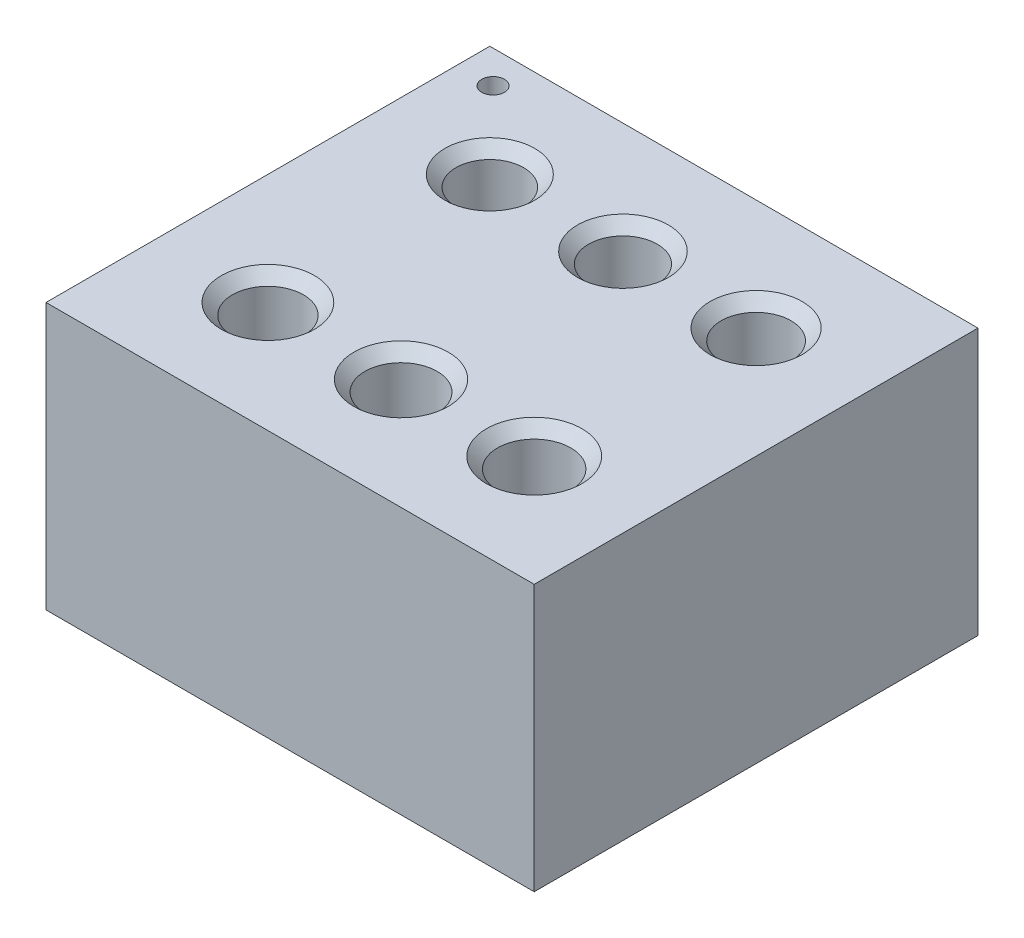
ISO-10303-21;
HEADER;
FILE_DESCRIPTION(('STEP AP214'),'2;1');
FILE_NAME('part.step','',(''),(''),'','','');
FILE_SCHEMA(('AUTOMOTIVE_DESIGN { 1 0 10303 214 1 1 1 1 }'));
ENDSEC;
DATA;
#1=APPLICATION_CONTEXT('core data for automotive mechanical design processes');
#2=APPLICATION_PROTOCOL_DEFINITION('international standard','automotive_design',2000,#1);
#3=PRODUCT_CONTEXT('',#1,'mechanical');
#4=PRODUCT('Part','Part','',(#3));
#5=PRODUCT_RELATED_PRODUCT_CATEGORY('part','',(#4));
#6=PRODUCT_DEFINITION_FORMATION('','',#4);
#7=PRODUCT_DEFINITION_CONTEXT('part definition',#1,'design');
#8=PRODUCT_DEFINITION('design','',#6,#7);
#9=PRODUCT_DEFINITION_SHAPE('','',#8);
#10=(LENGTH_UNIT() NAMED_UNIT(*) SI_UNIT(.MILLI.,.METRE.));
#11=(NAMED_UNIT(*) PLANE_ANGLE_UNIT() SI_UNIT($,.RADIAN.));
#12=(NAMED_UNIT(*) SI_UNIT($,.STERADIAN.) SOLID_ANGLE_UNIT());
#13=UNCERTAINTY_MEASURE_WITH_UNIT(LENGTH_MEASURE(1.E-05),#10,'distance_accuracy_value','');
#14=(GEOMETRIC_REPRESENTATION_CONTEXT(3) GLOBAL_UNCERTAINTY_ASSIGNED_CONTEXT((#13)) GLOBAL_UNIT_ASSIGNED_CONTEXT((#10,
#11,#12)) REPRESENTATION_CONTEXT('',''));
#15=CARTESIAN_POINT('',(0.,0.,0.));
#16=DIRECTION('',(0.,0.,1.));
#17=DIRECTION('',(1.,0.,0.));
#18=AXIS2_PLACEMENT_3D('',#15,#16,#17);
#19=CARTESIAN_POINT('',(0.,-12.,10.));
#20=DIRECTION('',(0.,0.,1.));
#21=DIRECTION('',(1.,0.,0.));
#22=AXIS2_PLACEMENT_3D('',#19,#20,#21);
#23=PLANE('',#22);
#24=DIRECTION('',(1.,0.,0.));
#25=VECTOR('',#24,1.);
#26=CARTESIAN_POINT('',(0.,0.,10.));
#27=LINE('',#26,#25);
#28=CARTESIAN_POINT('',(-11.,0.,10.));
#29=VERTEX_POINT('',#28);
#30=CARTESIAN_POINT('',(11.,0.,10.));
#31=VERTEX_POINT('',#30);
#32=EDGE_CURVE('E130',#29,#31,#27,.T.);
#33=ORIENTED_EDGE('',*,*,#32,.F.);
#34=DIRECTION('',(0.,1.,0.));
#35=VECTOR('',#34,1.);
#36=CARTESIAN_POINT('',(-11.,-12.,10.));
#37=LINE('',#36,#35);
#38=CARTESIAN_POINT('',(-11.,-12.,10.));
#39=VERTEX_POINT('',#38);
#40=EDGE_CURVE('E67',#39,#29,#37,.T.);
#41=ORIENTED_EDGE('',*,*,#40,.F.);
#42=DIRECTION('',(1.,0.,0.));
#43=VECTOR('',#42,1.);
#44=CARTESIAN_POINT('',(0.,-12.,10.));
#45=LINE('',#44,#43);
#46=CARTESIAN_POINT('',(11.,-12.,10.));
#47=VERTEX_POINT('',#46);
#48=EDGE_CURVE('E117',#39,#47,#45,.T.);
#49=ORIENTED_EDGE('',*,*,#48,.T.);
#50=DIRECTION('',(0.,1.,0.));
#51=VECTOR('',#50,1.);
#52=CARTESIAN_POINT('',(11.,-12.,10.));
#53=LINE('',#52,#51);
#54=EDGE_CURVE('E95',#47,#31,#53,.T.);
#55=ORIENTED_EDGE('',*,*,#54,.T.);
#56=EDGE_LOOP('',(#33,#41,#49,#55));
#57=FACE_BOUND('',#56,.T.);
#58=ADVANCED_FACE('F48',(#57),#23,.T.);
#59=CARTESIAN_POINT('',(-11.,-12.,0.));
#60=DIRECTION('',(1.,0.,0.));
#61=DIRECTION('',(0.,0.,-1.));
#62=AXIS2_PLACEMENT_3D('',#59,#60,#61);
#63=PLANE('',#62);
#64=DIRECTION('',(0.,0.,-1.));
#65=VECTOR('',#64,1.);
#66=CARTESIAN_POINT('',(-11.,0.,0.));
#67=LINE('',#66,#65);
#68=CARTESIAN_POINT('',(-11.,0.,-10.));
#69=VERTEX_POINT('',#68);
#70=EDGE_CURVE('E140',#29,#69,#67,.T.);
#71=ORIENTED_EDGE('',*,*,#70,.T.);
#72=DIRECTION('',(0.,1.,0.));
#73=VECTOR('',#72,1.);
#74=CARTESIAN_POINT('',(-11.,-12.,-10.));
#75=LINE('',#74,#73);
#76=CARTESIAN_POINT('',(-11.,-12.,-10.));
#77=VERTEX_POINT('',#76);
#78=EDGE_CURVE('E113',#77,#69,#75,.T.);
#79=ORIENTED_EDGE('',*,*,#78,.F.);
#80=DIRECTION('',(0.,0.,-1.));
#81=VECTOR('',#80,1.);
#82=CARTESIAN_POINT('',(-11.,-12.,0.));
#83=LINE('',#82,#81);
#84=EDGE_CURVE('E105',#39,#77,#83,.T.);
#85=ORIENTED_EDGE('',*,*,#84,.F.);
#86=ORIENTED_EDGE('',*,*,#40,.T.);
#87=EDGE_LOOP('',(#71,#79,#85,#86));
#88=FACE_BOUND('',#87,.T.);
#89=ADVANCED_FACE('F210',(#88),#63,.F.);
#90=CARTESIAN_POINT('',(0.,-12.,-10.));
#91=DIRECTION('',(0.,0.,1.));
#92=DIRECTION('',(1.,0.,0.));
#93=AXIS2_PLACEMENT_3D('',#90,#91,#92);
#94=PLANE('',#93);
#95=DIRECTION('',(1.,0.,0.));
#96=VECTOR('',#95,1.);
#97=CARTESIAN_POINT('',(0.,0.,-10.));
#98=LINE('',#97,#96);
#99=CARTESIAN_POINT('',(11.,0.,-10.));
#100=VERTEX_POINT('',#99);
#101=EDGE_CURVE('E85',#69,#100,#98,.T.);
#102=ORIENTED_EDGE('',*,*,#101,.T.);
#103=DIRECTION('',(0.,1.,0.));
#104=VECTOR('',#103,1.);
#105=CARTESIAN_POINT('',(11.,-12.,-10.));
#106=LINE('',#105,#104);
#107=CARTESIAN_POINT('',(11.,-12.,-10.));
#108=VERTEX_POINT('',#107);
#109=EDGE_CURVE('E110',#108,#100,#106,.T.);
#110=ORIENTED_EDGE('',*,*,#109,.F.);
#111=DIRECTION('',(1.,0.,0.));
#112=VECTOR('',#111,1.);
#113=CARTESIAN_POINT('',(0.,-12.,-10.));
#114=LINE('',#113,#112);
#115=EDGE_CURVE('E100',#77,#108,#114,.T.);
#116=ORIENTED_EDGE('',*,*,#115,.F.);
#117=ORIENTED_EDGE('',*,*,#78,.T.);
#118=EDGE_LOOP('',(#102,#110,#116,#117));
#119=FACE_BOUND('',#118,.T.);
#120=ADVANCED_FACE('F111',(#119),#94,.F.);
#121=CARTESIAN_POINT('',(-9.38156460825946,-12.,-8.52869509841769));
#122=DIRECTION('',(0.,1.,0.));
#123=DIRECTION('',(0.,0.,1.));
#124=AXIS2_PLACEMENT_3D('',#121,#122,#123);
#125=CYLINDRICAL_SURFACE('',#124,0.511248756854966);
#126=CARTESIAN_POINT('',(-9.38156460825946,-12.,-8.52869509841769));
#127=DIRECTION('',(0.,1.,0.));
#128=DIRECTION('',(0.,0.,1.));
#129=AXIS2_PLACEMENT_3D('',#126,#127,#128);
#130=CIRCLE('',#129,0.511248756854966);
#131=CARTESIAN_POINT('',(-9.38156460825946,-12.,-8.01744634156273));
#132=VERTEX_POINT('',#131);
#133=EDGE_CURVE('E120',#132,#132,#130,.T.);
#134=ORIENTED_EDGE('',*,*,#133,.F.);
#135=EDGE_LOOP('',(#134));
#136=FACE_BOUND('',#135,.T.);
#137=CARTESIAN_POINT('',(-9.38156460825946,0.,-8.52869509841769));
#138=DIRECTION('',(0.,1.,0.));
#139=DIRECTION('',(0.,0.,1.));
#140=AXIS2_PLACEMENT_3D('',#137,#138,#139);
#141=CIRCLE('',#140,0.511248756854966);
#142=CARTESIAN_POINT('',(-9.38156460825946,0.,-8.01744634156273));
#143=VERTEX_POINT('',#142);
#144=EDGE_CURVE('E126',#143,#143,#141,.T.);
#145=ORIENTED_EDGE('',*,*,#144,.T.);
#146=EDGE_LOOP('',(#145));
#147=FACE_BOUND('',#146,.T.);
#148=ADVANCED_FACE('F219',(#136,#147),#125,.F.);
#149=CARTESIAN_POINT('',(11.,-12.,0.));
#150=DIRECTION('',(1.,0.,0.));
#151=DIRECTION('',(0.,0.,-1.));
#152=AXIS2_PLACEMENT_3D('',#149,#150,#151);
#153=PLANE('',#152);
#154=DIRECTION('',(0.,0.,-1.));
#155=VECTOR('',#154,1.);
#156=CARTESIAN_POINT('',(11.,0.,0.));
#157=LINE('',#156,#155);
#158=EDGE_CURVE('E135',#31,#100,#157,.T.);
#159=ORIENTED_EDGE('',*,*,#158,.F.);
#160=ORIENTED_EDGE('',*,*,#54,.F.);
#161=DIRECTION('',(0.,0.,-1.));
#162=VECTOR('',#161,1.);
#163=CARTESIAN_POINT('',(11.,-12.,0.));
#164=LINE('',#163,#162);
#165=EDGE_CURVE('E104',#47,#108,#164,.T.);
#166=ORIENTED_EDGE('',*,*,#165,.T.);
#167=ORIENTED_EDGE('',*,*,#109,.T.);
#168=EDGE_LOOP('',(#159,#160,#166,#167));
#169=FACE_BOUND('',#168,.T.);
#170=ADVANCED_FACE('F115',(#169),#153,.T.);
#171=CARTESIAN_POINT('',(0.,-12.,0.));
#172=DIRECTION('',(0.,1.,0.));
#173=DIRECTION('',(0.,0.,1.));
#174=AXIS2_PLACEMENT_3D('',#171,#172,#173);
#175=PLANE('',#174);
#176=CARTESIAN_POINT('',(6.,-12.,5.));
#177=DIRECTION('',(0.,1.,0.));
#178=DIRECTION('',(0.,0.,1.));
#179=AXIS2_PLACEMENT_3D('',#176,#177,#178);
#180=CIRCLE('',#179,1.65);
#181=CARTESIAN_POINT('',(6.,-12.,6.65));
#182=VERTEX_POINT('',#181);
#183=EDGE_CURVE('E262',#182,#182,#180,.T.);
#184=ORIENTED_EDGE('',*,*,#183,.T.);
#185=EDGE_LOOP('',(#184));
#186=FACE_BOUND('',#185,.T.);
#187=CARTESIAN_POINT('',(0.,-12.,5.));
#188=DIRECTION('',(0.,1.,0.));
#189=DIRECTION('',(0.,0.,1.));
#190=AXIS2_PLACEMENT_3D('',#187,#188,#189);
#191=CIRCLE('',#190,1.625);
#192=CARTESIAN_POINT('',(0.,-12.,6.625));
#193=VERTEX_POINT('',#192);
#194=EDGE_CURVE('E265',#193,#193,#191,.T.);
#195=ORIENTED_EDGE('',*,*,#194,.T.);
#196=EDGE_LOOP('',(#195));
#197=FACE_BOUND('',#196,.T.);
#198=CARTESIAN_POINT('',(0.,-12.,-5.));
#199=DIRECTION('',(0.,1.,0.));
#200=DIRECTION('',(0.,0.,1.));
#201=AXIS2_PLACEMENT_3D('',#198,#199,#200);
#202=CIRCLE('',#201,1.55);
#203=CARTESIAN_POINT('',(0.,-12.,-3.45));
#204=VERTEX_POINT('',#203);
#205=EDGE_CURVE('E271',#204,#204,#202,.T.);
#206=ORIENTED_EDGE('',*,*,#205,.T.);
#207=EDGE_LOOP('',(#206));
#208=FACE_BOUND('',#207,.T.);
#209=CARTESIAN_POINT('',(-6.,-12.,5.));
#210=DIRECTION('',(0.,1.,0.));
#211=DIRECTION('',(0.,0.,1.));
#212=AXIS2_PLACEMENT_3D('',#209,#210,#211);
#213=CIRCLE('',#212,1.6);
#214=CARTESIAN_POINT('',(-6.,-12.,6.6));
#215=VERTEX_POINT('',#214);
#216=EDGE_CURVE('E276',#215,#215,#213,.T.);
#217=ORIENTED_EDGE('',*,*,#216,.T.);
#218=EDGE_LOOP('',(#217));
#219=FACE_BOUND('',#218,.T.);
#220=CARTESIAN_POINT('',(6.,-12.,-5.));
#221=DIRECTION('',(0.,1.,0.));
#222=DIRECTION('',(0.,0.,1.));
#223=AXIS2_PLACEMENT_3D('',#220,#221,#222);
#224=CIRCLE('',#223,1.575);
#225=CARTESIAN_POINT('',(6.,-12.,-3.425));
#226=VERTEX_POINT('',#225);
#227=EDGE_CURVE('E266',#226,#226,#224,.T.);
#228=ORIENTED_EDGE('',*,*,#227,.T.);
#229=EDGE_LOOP('',(#228));
#230=FACE_BOUND('',#229,.T.);
#231=CARTESIAN_POINT('',(-6.,-12.,-5.));
#232=DIRECTION('',(0.,1.,0.));
#233=DIRECTION('',(0.,0.,1.));
#234=AXIS2_PLACEMENT_3D('',#231,#232,#233);
#235=CIRCLE('',#234,1.525);
#236=CARTESIAN_POINT('',(-6.,-12.,-3.475));
#237=VERTEX_POINT('',#236);
#238=EDGE_CURVE('E131',#237,#237,#235,.T.);
#239=ORIENTED_EDGE('',*,*,#238,.T.);
#240=EDGE_LOOP('',(#239));
#241=FACE_BOUND('',#240,.T.);
#242=ORIENTED_EDGE('',*,*,#133,.T.);
#243=EDGE_LOOP('',(#242));
#244=FACE_BOUND('',#243,.T.);
#245=ORIENTED_EDGE('',*,*,#48,.F.);
#246=ORIENTED_EDGE('',*,*,#84,.T.);
#247=ORIENTED_EDGE('',*,*,#115,.T.);
#248=ORIENTED_EDGE('',*,*,#165,.F.);
#249=EDGE_LOOP('',(#245,#246,#247,#248));
#250=FACE_BOUND('',#249,.T.);
#251=ADVANCED_FACE('F103',(#186,#197,#208,#219,#230,#241,#244,#250),#175,.F.);
#252=CARTESIAN_POINT('',(0.,0.,0.));
#253=DIRECTION('',(0.,1.,0.));
#254=DIRECTION('',(0.,0.,1.));
#255=AXIS2_PLACEMENT_3D('',#252,#253,#254);
#256=PLANE('',#255);
#257=CARTESIAN_POINT('',(-6.,0.,5.));
#258=DIRECTION('',(0.,1.,0.));
#259=DIRECTION('',(0.,0.,1.));
#260=AXIS2_PLACEMENT_3D('',#257,#258,#259);
#261=CIRCLE('',#260,2.10000000000001);
#262=CARTESIAN_POINT('',(-6.,0.,7.10000000000001));
#263=VERTEX_POINT('',#262);
#264=EDGE_CURVE('E173',#263,#263,#261,.F.);
#265=ORIENTED_EDGE('',*,*,#264,.T.);
#266=EDGE_LOOP('',(#265));
#267=FACE_BOUND('',#266,.T.);
#268=CARTESIAN_POINT('',(0.,0.,5.));
#269=DIRECTION('',(0.,1.,0.));
#270=DIRECTION('',(0.,0.,1.));
#271=AXIS2_PLACEMENT_3D('',#268,#269,#270);
#272=CIRCLE('',#271,2.12500000000001);
#273=CARTESIAN_POINT('',(0.,0.,7.12500000000001));
#274=VERTEX_POINT('',#273);
#275=EDGE_CURVE('E169',#274,#274,#272,.F.);
#276=ORIENTED_EDGE('',*,*,#275,.T.);
#277=EDGE_LOOP('',(#276));
#278=FACE_BOUND('',#277,.T.);
#279=CARTESIAN_POINT('',(6.,0.,5.));
#280=DIRECTION('',(0.,1.,0.));
#281=DIRECTION('',(0.,0.,1.));
#282=AXIS2_PLACEMENT_3D('',#279,#280,#281);
#283=CIRCLE('',#282,2.15000000000001);
#284=CARTESIAN_POINT('',(6.,0.,7.15000000000001));
#285=VERTEX_POINT('',#284);
#286=EDGE_CURVE('E165',#285,#285,#283,.F.);
#287=ORIENTED_EDGE('',*,*,#286,.T.);
#288=EDGE_LOOP('',(#287));
#289=FACE_BOUND('',#288,.T.);
#290=CARTESIAN_POINT('',(6.,0.,-5.));
#291=DIRECTION('',(0.,1.,0.));
#292=DIRECTION('',(0.,0.,1.));
#293=AXIS2_PLACEMENT_3D('',#290,#291,#292);
#294=CIRCLE('',#293,2.07500000000001);
#295=CARTESIAN_POINT('',(6.,0.,-2.92499999999999));
#296=VERTEX_POINT('',#295);
#297=EDGE_CURVE('E161',#296,#296,#294,.F.);
#298=ORIENTED_EDGE('',*,*,#297,.T.);
#299=EDGE_LOOP('',(#298));
#300=FACE_BOUND('',#299,.T.);
#301=CARTESIAN_POINT('',(0.,0.,-5.));
#302=DIRECTION('',(0.,1.,0.));
#303=DIRECTION('',(0.,0.,1.));
#304=AXIS2_PLACEMENT_3D('',#301,#302,#303);
#305=CIRCLE('',#304,2.05000000000001);
#306=CARTESIAN_POINT('',(0.,0.,-2.94999999999999));
#307=VERTEX_POINT('',#306);
#308=EDGE_CURVE('E157',#307,#307,#305,.F.);
#309=ORIENTED_EDGE('',*,*,#308,.T.);
#310=EDGE_LOOP('',(#309));
#311=FACE_BOUND('',#310,.T.);
#312=CARTESIAN_POINT('',(-6.,0.,-5.));
#313=DIRECTION('',(0.,1.,0.));
#314=DIRECTION('',(0.,0.,1.));
#315=AXIS2_PLACEMENT_3D('',#312,#313,#314);
#316=CIRCLE('',#315,2.02500000000002);
#317=CARTESIAN_POINT('',(-6.,0.,-2.97499999999998));
#318=VERTEX_POINT('',#317);
#319=EDGE_CURVE('E153',#318,#318,#316,.F.);
#320=ORIENTED_EDGE('',*,*,#319,.T.);
#321=EDGE_LOOP('',(#320));
#322=FACE_BOUND('',#321,.T.);
#323=ORIENTED_EDGE('',*,*,#144,.F.);
#324=EDGE_LOOP('',(#323));
#325=FACE_BOUND('',#324,.T.);
#326=ORIENTED_EDGE('',*,*,#32,.T.);
#327=ORIENTED_EDGE('',*,*,#158,.T.);
#328=ORIENTED_EDGE('',*,*,#101,.F.);
#329=ORIENTED_EDGE('',*,*,#70,.F.);
#330=EDGE_LOOP('',(#326,#327,#328,#329));
#331=FACE_BOUND('',#330,.T.);
#332=ADVANCED_FACE('F292',(#267,#278,#289,#300,#311,#322,#325,#331),#256,.T.);
#333=CARTESIAN_POINT('',(-6.,-12.,-5.));
#334=DIRECTION('',(0.,1.,0.));
#335=DIRECTION('',(0.,0.,1.));
#336=AXIS2_PLACEMENT_3D('',#333,#334,#335);
#337=CYLINDRICAL_SURFACE('',#336,1.525);
#338=CARTESIAN_POINT('',(-6.,-0.500000000000013,-5.));
#339=DIRECTION('',(0.,1.,0.));
#340=DIRECTION('',(0.,0.,1.));
#341=AXIS2_PLACEMENT_3D('',#338,#339,#340);
#342=CIRCLE('',#341,1.525);
#343=CARTESIAN_POINT('',(-6.,-0.500000000000013,-3.475));
#344=VERTEX_POINT('',#343);
#345=EDGE_CURVE('E11',#344,#344,#342,.T.);
#346=ORIENTED_EDGE('',*,*,#345,.T.);
#347=EDGE_LOOP('',(#346));
#348=FACE_BOUND('',#347,.T.);
#349=ORIENTED_EDGE('',*,*,#238,.F.);
#350=EDGE_LOOP('',(#349));
#351=FACE_BOUND('',#350,.T.);
#352=ADVANCED_FACE('F294',(#348,#351),#337,.F.);
#353=CARTESIAN_POINT('',(6.,-12.,-5.));
#354=DIRECTION('',(0.,1.,0.));
#355=DIRECTION('',(0.,0.,1.));
#356=AXIS2_PLACEMENT_3D('',#353,#354,#355);
#357=CYLINDRICAL_SURFACE('',#356,1.575);
#358=CARTESIAN_POINT('',(6.,-0.500000000000004,-5.));
#359=DIRECTION('',(0.,1.,0.));
#360=DIRECTION('',(0.,0.,1.));
#361=AXIS2_PLACEMENT_3D('',#358,#359,#360);
#362=CIRCLE('',#361,1.575);
#363=CARTESIAN_POINT('',(6.,-0.500000000000004,-3.425));
#364=VERTEX_POINT('',#363);
#365=EDGE_CURVE('E185',#364,#364,#362,.T.);
#366=ORIENTED_EDGE('',*,*,#365,.T.);
#367=EDGE_LOOP('',(#366));
#368=FACE_BOUND('',#367,.T.);
#369=ORIENTED_EDGE('',*,*,#227,.F.);
#370=EDGE_LOOP('',(#369));
#371=FACE_BOUND('',#370,.T.);
#372=ADVANCED_FACE('F301',(#368,#371),#357,.F.);
#373=CARTESIAN_POINT('',(-6.,-12.,5.));
#374=DIRECTION('',(0.,1.,0.));
#375=DIRECTION('',(0.,0.,1.));
#376=AXIS2_PLACEMENT_3D('',#373,#374,#375);
#377=CYLINDRICAL_SURFACE('',#376,1.6);
#378=CARTESIAN_POINT('',(-6.,-0.500000000000006,5.));
#379=DIRECTION('',(0.,1.,0.));
#380=DIRECTION('',(0.,0.,1.));
#381=AXIS2_PLACEMENT_3D('',#378,#379,#380);
#382=CIRCLE('',#381,1.6);
#383=CARTESIAN_POINT('',(-6.,-0.500000000000006,6.6));
#384=VERTEX_POINT('',#383);
#385=EDGE_CURVE('E145',#384,#384,#382,.T.);
#386=ORIENTED_EDGE('',*,*,#385,.T.);
#387=EDGE_LOOP('',(#386));
#388=FACE_BOUND('',#387,.T.);
#389=ORIENTED_EDGE('',*,*,#216,.F.);
#390=EDGE_LOOP('',(#389));
#391=FACE_BOUND('',#390,.T.);
#392=ADVANCED_FACE('F347',(#388,#391),#377,.F.);
#393=CARTESIAN_POINT('',(0.,-12.,-5.));
#394=DIRECTION('',(0.,1.,0.));
#395=DIRECTION('',(0.,0.,1.));
#396=AXIS2_PLACEMENT_3D('',#393,#394,#395);
#397=CYLINDRICAL_SURFACE('',#396,1.55);
#398=CARTESIAN_POINT('',(0.,-0.5,-5.));
#399=DIRECTION('',(0.,1.,0.));
#400=DIRECTION('',(0.,0.,1.));
#401=AXIS2_PLACEMENT_3D('',#398,#399,#400);
#402=CIRCLE('',#401,1.55);
#403=CARTESIAN_POINT('',(0.,-0.5,-3.45));
#404=VERTEX_POINT('',#403);
#405=EDGE_CURVE('E59',#404,#404,#402,.T.);
#406=ORIENTED_EDGE('',*,*,#405,.T.);
#407=EDGE_LOOP('',(#406));
#408=FACE_BOUND('',#407,.T.);
#409=ORIENTED_EDGE('',*,*,#205,.F.);
#410=EDGE_LOOP('',(#409));
#411=FACE_BOUND('',#410,.T.);
#412=ADVANCED_FACE('F192',(#408,#411),#397,.F.);
#413=CARTESIAN_POINT('',(0.,-12.,5.));
#414=DIRECTION('',(0.,1.,0.));
#415=DIRECTION('',(0.,0.,1.));
#416=AXIS2_PLACEMENT_3D('',#413,#414,#415);
#417=CYLINDRICAL_SURFACE('',#416,1.625);
#418=CARTESIAN_POINT('',(0.,-0.500000000000004,5.));
#419=DIRECTION('',(0.,1.,0.));
#420=DIRECTION('',(0.,0.,1.));
#421=AXIS2_PLACEMENT_3D('',#418,#419,#420);
#422=CIRCLE('',#421,1.625);
#423=CARTESIAN_POINT('',(0.,-0.500000000000004,6.625));
#424=VERTEX_POINT('',#423);
#425=EDGE_CURVE('E177',#424,#424,#422,.T.);
#426=ORIENTED_EDGE('',*,*,#425,.T.);
#427=EDGE_LOOP('',(#426));
#428=FACE_BOUND('',#427,.T.);
#429=ORIENTED_EDGE('',*,*,#194,.F.);
#430=EDGE_LOOP('',(#429));
#431=FACE_BOUND('',#430,.T.);
#432=ADVANCED_FACE('F258',(#428,#431),#417,.F.);
#433=CARTESIAN_POINT('',(6.,-12.,5.));
#434=DIRECTION('',(0.,1.,0.));
#435=DIRECTION('',(0.,0.,1.));
#436=AXIS2_PLACEMENT_3D('',#433,#434,#435);
#437=CYLINDRICAL_SURFACE('',#436,1.65);
#438=CARTESIAN_POINT('',(6.,-0.500000000000004,5.));
#439=DIRECTION('',(0.,1.,0.));
#440=DIRECTION('',(0.,0.,1.));
#441=AXIS2_PLACEMENT_3D('',#438,#439,#440);
#442=CIRCLE('',#441,1.65);
#443=CARTESIAN_POINT('',(6.,-0.500000000000004,6.65));
#444=VERTEX_POINT('',#443);
#445=EDGE_CURVE('E181',#444,#444,#442,.T.);
#446=ORIENTED_EDGE('',*,*,#445,.T.);
#447=EDGE_LOOP('',(#446));
#448=FACE_BOUND('',#447,.T.);
#449=ORIENTED_EDGE('',*,*,#183,.F.);
#450=EDGE_LOOP('',(#449));
#451=FACE_BOUND('',#450,.T.);
#452=ADVANCED_FACE('F231',(#448,#451),#437,.F.);
#453=CARTESIAN_POINT('',(-6.,-0.500000000000006,5.));
#454=DIRECTION('',(0.,1.,0.));
#455=DIRECTION('',(0.,0.,1.));
#456=AXIS2_PLACEMENT_3D('',#453,#454,#455);
#457=CONICAL_SURFACE('',#456,1.6,0.785398163397449);
#458=ORIENTED_EDGE('',*,*,#264,.F.);
#459=EDGE_LOOP('',(#458));
#460=FACE_BOUND('',#459,.T.);
#461=ORIENTED_EDGE('',*,*,#385,.F.);
#462=EDGE_LOOP('',(#461));
#463=FACE_BOUND('',#462,.T.);
#464=ADVANCED_FACE('F224',(#460,#463),#457,.F.);
#465=CARTESIAN_POINT('',(0.,-0.500000000000004,5.));
#466=DIRECTION('',(0.,1.,0.));
#467=DIRECTION('',(0.,0.,1.));
#468=AXIS2_PLACEMENT_3D('',#465,#466,#467);
#469=CONICAL_SURFACE('',#468,1.625,0.785398163397449);
#470=ORIENTED_EDGE('',*,*,#275,.F.);
#471=EDGE_LOOP('',(#470));
#472=FACE_BOUND('',#471,.T.);
#473=ORIENTED_EDGE('',*,*,#425,.F.);
#474=EDGE_LOOP('',(#473));
#475=FACE_BOUND('',#474,.T.);
#476=ADVANCED_FACE('F230',(#472,#475),#469,.F.);
#477=CARTESIAN_POINT('',(6.,-0.500000000000004,5.));
#478=DIRECTION('',(0.,1.,0.));
#479=DIRECTION('',(0.,0.,1.));
#480=AXIS2_PLACEMENT_3D('',#477,#478,#479);
#481=CONICAL_SURFACE('',#480,1.65,0.785398163397453);
#482=ORIENTED_EDGE('',*,*,#286,.F.);
#483=EDGE_LOOP('',(#482));
#484=FACE_BOUND('',#483,.T.);
#485=ORIENTED_EDGE('',*,*,#445,.F.);
#486=EDGE_LOOP('',(#485));
#487=FACE_BOUND('',#486,.T.);
#488=ADVANCED_FACE('F204',(#484,#487),#481,.F.);
#489=CARTESIAN_POINT('',(6.,-0.500000000000004,-5.));
#490=DIRECTION('',(0.,1.,0.));
#491=DIRECTION('',(0.,0.,1.));
#492=AXIS2_PLACEMENT_3D('',#489,#490,#491);
#493=CONICAL_SURFACE('',#492,1.575,0.785398163397453);
#494=ORIENTED_EDGE('',*,*,#297,.F.);
#495=EDGE_LOOP('',(#494));
#496=FACE_BOUND('',#495,.T.);
#497=ORIENTED_EDGE('',*,*,#365,.F.);
#498=EDGE_LOOP('',(#497));
#499=FACE_BOUND('',#498,.T.);
#500=ADVANCED_FACE('F197',(#496,#499),#493,.F.);
#501=CARTESIAN_POINT('',(0.,-0.5,-5.));
#502=DIRECTION('',(0.,1.,0.));
#503=DIRECTION('',(0.,0.,1.));
#504=AXIS2_PLACEMENT_3D('',#501,#502,#503);
#505=CONICAL_SURFACE('',#504,1.55,0.785398163397454);
#506=ORIENTED_EDGE('',*,*,#308,.F.);
#507=EDGE_LOOP('',(#506));
#508=FACE_BOUND('',#507,.T.);
#509=ORIENTED_EDGE('',*,*,#405,.F.);
#510=EDGE_LOOP('',(#509));
#511=FACE_BOUND('',#510,.T.);
#512=ADVANCED_FACE('F195',(#508,#511),#505,.F.);
#513=CARTESIAN_POINT('',(-6.,-0.500000000000013,-5.));
#514=DIRECTION('',(0.,1.,0.));
#515=DIRECTION('',(0.,0.,1.));
#516=AXIS2_PLACEMENT_3D('',#513,#514,#515);
#517=CONICAL_SURFACE('',#516,1.525,0.785398163397454);
#518=ORIENTED_EDGE('',*,*,#319,.F.);
#519=EDGE_LOOP('',(#518));
#520=FACE_BOUND('',#519,.T.);
#521=ORIENTED_EDGE('',*,*,#345,.F.);
#522=EDGE_LOOP('',(#521));
#523=FACE_BOUND('',#522,.T.);
#524=ADVANCED_FACE('F51',(#520,#523),#517,.F.);
#525=CLOSED_SHELL('',(#58,#89,#120,#148,#170,#251,#332,#352,#372,#392,#412,#432,#452,#464,#476,
#488,#500,#512,#524));
#526=MANIFOLD_SOLID_BREP('B2',#525);
#527=ADVANCED_BREP_SHAPE_REPRESENTATION('',(#18,#526),#14);
#528=SHAPE_DEFINITION_REPRESENTATION(#9,#527);
ENDSEC;
END-ISO-10303-21;
